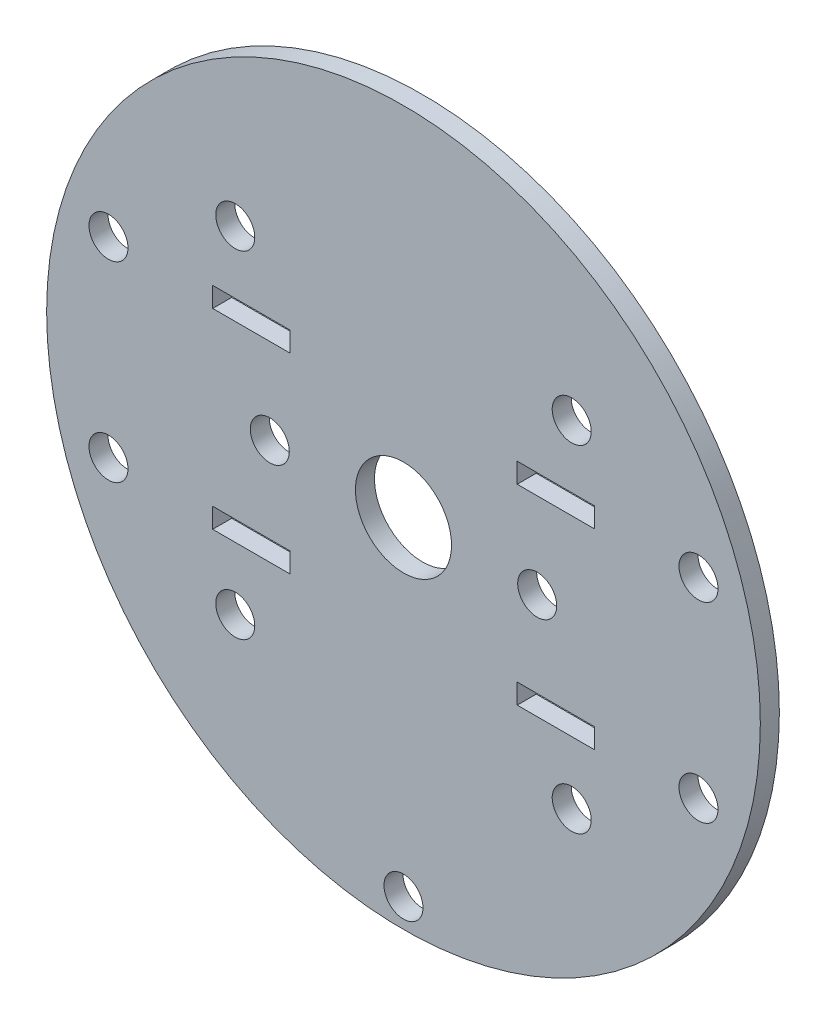
ISO-10303-21;
HEADER;
FILE_DESCRIPTION(('STEP AP214'),'2;1');
FILE_NAME('part.step','',(''),(''),'','','');
FILE_SCHEMA(('AUTOMOTIVE_DESIGN { 1 0 10303 214 1 1 1 1 }'));
ENDSEC;
DATA;
#1=APPLICATION_CONTEXT('core data for automotive mechanical design processes');
#2=APPLICATION_PROTOCOL_DEFINITION('international standard','automotive_design',2000,#1);
#3=PRODUCT_CONTEXT('',#1,'mechanical');
#4=PRODUCT('Part','Part','',(#3));
#5=PRODUCT_RELATED_PRODUCT_CATEGORY('part','',(#4));
#6=PRODUCT_DEFINITION_FORMATION('','',#4);
#7=PRODUCT_DEFINITION_CONTEXT('part definition',#1,'design');
#8=PRODUCT_DEFINITION('design','',#6,#7);
#9=PRODUCT_DEFINITION_SHAPE('','',#8);
#10=(LENGTH_UNIT() NAMED_UNIT(*) SI_UNIT(.MILLI.,.METRE.));
#11=(NAMED_UNIT(*) PLANE_ANGLE_UNIT() SI_UNIT($,.RADIAN.));
#12=(NAMED_UNIT(*) SI_UNIT($,.STERADIAN.) SOLID_ANGLE_UNIT());
#13=UNCERTAINTY_MEASURE_WITH_UNIT(LENGTH_MEASURE(1.E-05),#10,'distance_accuracy_value','');
#14=(GEOMETRIC_REPRESENTATION_CONTEXT(3) GLOBAL_UNCERTAINTY_ASSIGNED_CONTEXT((#13)) GLOBAL_UNIT_ASSIGNED_CONTEXT((#10,
#11,#12)) REPRESENTATION_CONTEXT('',''));
#15=CARTESIAN_POINT('',(0.,0.,0.));
#16=DIRECTION('',(0.,0.,1.));
#17=DIRECTION('',(1.,0.,0.));
#18=AXIS2_PLACEMENT_3D('',#15,#16,#17);
#19=CARTESIAN_POINT('',(0.,0.,2.));
#20=DIRECTION('',(0.,0.,1.));
#21=DIRECTION('',(1.,0.,0.));
#22=AXIS2_PLACEMENT_3D('',#19,#20,#21);
#23=PLANE('',#22);
#24=CARTESIAN_POINT('',(-14.05,0.,2.));
#25=DIRECTION('',(0.,0.,1.));
#26=DIRECTION('',(1.,0.,0.));
#27=AXIS2_PLACEMENT_3D('',#24,#25,#26);
#28=CIRCLE('',#27,2.05);
#29=CARTESIAN_POINT('',(-12.,0.,2.));
#30=VERTEX_POINT('',#29);
#31=EDGE_CURVE('E336',#30,#30,#28,.T.);
#32=ORIENTED_EDGE('',*,*,#31,.F.);
#33=EDGE_LOOP('',(#32));
#34=FACE_BOUND('',#33,.T.);
#35=CARTESIAN_POINT('',(31.,-10.05,2.));
#36=DIRECTION('',(0.,0.,1.));
#37=DIRECTION('',(-1.,0.,0.));
#38=AXIS2_PLACEMENT_3D('',#35,#36,#37);
#39=CIRCLE('',#38,2.05);
#40=CARTESIAN_POINT('',(28.95,-10.05,2.));
#41=VERTEX_POINT('',#40);
#42=EDGE_CURVE('E340',#41,#41,#39,.T.);
#43=ORIENTED_EDGE('',*,*,#42,.F.);
#44=EDGE_LOOP('',(#43));
#45=FACE_BOUND('',#44,.T.);
#46=CARTESIAN_POINT('',(-31.,10.05,2.));
#47=DIRECTION('',(0.,0.,1.));
#48=DIRECTION('',(-1.,0.,0.));
#49=AXIS2_PLACEMENT_3D('',#46,#47,#48);
#50=CIRCLE('',#49,2.05);
#51=CARTESIAN_POINT('',(-33.05,10.05,2.));
#52=VERTEX_POINT('',#51);
#53=EDGE_CURVE('E343',#52,#52,#50,.T.);
#54=ORIENTED_EDGE('',*,*,#53,.F.);
#55=EDGE_LOOP('',(#54));
#56=FACE_BOUND('',#55,.T.);
#57=DIRECTION('',(0.,1.,0.));
#58=VECTOR('',#57,1.);
#59=CARTESIAN_POINT('',(-11.95,-11.1,2.));
#60=LINE('',#59,#58);
#61=CARTESIAN_POINT('',(-11.95,-11.1,2.));
#62=VERTEX_POINT('',#61);
#63=CARTESIAN_POINT('',(-11.95,-8.99999999999999,2.));
#64=VERTEX_POINT('',#63);
#65=EDGE_CURVE('E156',#62,#64,#60,.T.);
#66=ORIENTED_EDGE('',*,*,#65,.F.);
#67=DIRECTION('',(1.,0.,0.));
#68=VECTOR('',#67,1.);
#69=CARTESIAN_POINT('',(-11.95,-11.1,2.));
#70=LINE('',#69,#68);
#71=CARTESIAN_POINT('',(-20.05,-11.1,2.));
#72=VERTEX_POINT('',#71);
#73=EDGE_CURVE('E148',#72,#62,#70,.T.);
#74=ORIENTED_EDGE('',*,*,#73,.F.);
#75=DIRECTION('',(0.,-1.,0.));
#76=VECTOR('',#75,1.);
#77=CARTESIAN_POINT('',(-20.05,-11.1,2.));
#78=LINE('',#77,#76);
#79=CARTESIAN_POINT('',(-20.05,-8.99999999999999,2.));
#80=VERTEX_POINT('',#79);
#81=EDGE_CURVE('E171',#80,#72,#78,.T.);
#82=ORIENTED_EDGE('',*,*,#81,.F.);
#83=DIRECTION('',(-1.,0.,0.));
#84=VECTOR('',#83,1.);
#85=CARTESIAN_POINT('',(-11.95,-8.99999999999999,2.));
#86=LINE('',#85,#84);
#87=EDGE_CURVE('E169',#64,#80,#86,.T.);
#88=ORIENTED_EDGE('',*,*,#87,.F.);
#89=EDGE_LOOP('',(#66,#74,#82,#88));
#90=FACE_BOUND('',#89,.T.);
#91=DIRECTION('',(0.,-1.,0.));
#92=VECTOR('',#91,1.);
#93=CARTESIAN_POINT('',(-20.05,11.1,2.));
#94=LINE('',#93,#92);
#95=CARTESIAN_POINT('',(-20.05,11.1,2.));
#96=VERTEX_POINT('',#95);
#97=CARTESIAN_POINT('',(-20.05,8.99999999999999,2.));
#98=VERTEX_POINT('',#97);
#99=EDGE_CURVE('E189',#96,#98,#94,.T.);
#100=ORIENTED_EDGE('',*,*,#99,.F.);
#101=DIRECTION('',(-1.,0.,0.));
#102=VECTOR('',#101,1.);
#103=CARTESIAN_POINT('',(-11.95,11.1,2.));
#104=LINE('',#103,#102);
#105=CARTESIAN_POINT('',(-11.95,11.1,2.));
#106=VERTEX_POINT('',#105);
#107=EDGE_CURVE('E187',#106,#96,#104,.T.);
#108=ORIENTED_EDGE('',*,*,#107,.F.);
#109=DIRECTION('',(0.,1.,0.));
#110=VECTOR('',#109,1.);
#111=CARTESIAN_POINT('',(-11.95,11.1,2.));
#112=LINE('',#111,#110);
#113=CARTESIAN_POINT('',(-11.95,8.99999999999999,2.));
#114=VERTEX_POINT('',#113);
#115=EDGE_CURVE('E195',#114,#106,#112,.T.);
#116=ORIENTED_EDGE('',*,*,#115,.F.);
#117=DIRECTION('',(1.,0.,0.));
#118=VECTOR('',#117,1.);
#119=CARTESIAN_POINT('',(-11.95,8.99999999999999,2.));
#120=LINE('',#119,#118);
#121=EDGE_CURVE('E192',#98,#114,#120,.T.);
#122=ORIENTED_EDGE('',*,*,#121,.F.);
#123=EDGE_LOOP('',(#100,#108,#116,#122));
#124=FACE_BOUND('',#123,.T.);
#125=CARTESIAN_POINT('',(17.6776695296637,-17.6776695296637,2.));
#126=DIRECTION('',(0.,0.,1.));
#127=DIRECTION('',(1.,0.,0.));
#128=AXIS2_PLACEMENT_3D('',#125,#126,#127);
#129=CIRCLE('',#128,2.05);
#130=CARTESIAN_POINT('',(19.7276695296637,-17.6776695296637,2.));
#131=VERTEX_POINT('',#130);
#132=EDGE_CURVE('E218',#131,#131,#129,.T.);
#133=ORIENTED_EDGE('',*,*,#132,.F.);
#134=EDGE_LOOP('',(#133));
#135=FACE_BOUND('',#134,.T.);
#136=CARTESIAN_POINT('',(-17.6776695296637,17.6776695296637,2.));
#137=DIRECTION('',(0.,0.,1.));
#138=DIRECTION('',(1.,0.,0.));
#139=AXIS2_PLACEMENT_3D('',#136,#137,#138);
#140=CIRCLE('',#139,2.05);
#141=CARTESIAN_POINT('',(-15.6276695296637,17.6776695296637,2.));
#142=VERTEX_POINT('',#141);
#143=EDGE_CURVE('E230',#142,#142,#140,.T.);
#144=ORIENTED_EDGE('',*,*,#143,.F.);
#145=EDGE_LOOP('',(#144));
#146=FACE_BOUND('',#145,.T.);
#147=CARTESIAN_POINT('',(0.,0.,2.));
#148=DIRECTION('',(0.,0.,1.));
#149=DIRECTION('',(1.,0.,0.));
#150=AXIS2_PLACEMENT_3D('',#147,#148,#149);
#151=CIRCLE('',#150,5.05);
#152=CARTESIAN_POINT('',(5.05,0.,2.));
#153=VERTEX_POINT('',#152);
#154=EDGE_CURVE('E304',#153,#153,#151,.T.);
#155=ORIENTED_EDGE('',*,*,#154,.F.);
#156=EDGE_LOOP('',(#155));
#157=FACE_BOUND('',#156,.T.);
#158=CARTESIAN_POINT('',(0.,0.,2.));
#159=DIRECTION('',(0.,0.,1.));
#160=DIRECTION('',(1.,0.,0.));
#161=AXIS2_PLACEMENT_3D('',#158,#159,#160);
#162=CIRCLE('',#161,37.5);
#163=CARTESIAN_POINT('',(37.5,0.,2.));
#164=VERTEX_POINT('',#163);
#165=EDGE_CURVE('E11',#164,#164,#162,.T.);
#166=ORIENTED_EDGE('',*,*,#165,.T.);
#167=EDGE_LOOP('',(#166));
#168=FACE_BOUND('',#167,.T.);
#169=CARTESIAN_POINT('',(-17.6776695296637,-17.6776695296637,2.));
#170=DIRECTION('',(0.,0.,1.));
#171=DIRECTION('',(1.,0.,0.));
#172=AXIS2_PLACEMENT_3D('',#169,#170,#171);
#173=CIRCLE('',#172,2.05);
#174=CARTESIAN_POINT('',(-15.6276695296637,-17.6776695296637,2.));
#175=VERTEX_POINT('',#174);
#176=EDGE_CURVE('E298',#175,#175,#173,.T.);
#177=ORIENTED_EDGE('',*,*,#176,.F.);
#178=EDGE_LOOP('',(#177));
#179=FACE_BOUND('',#178,.T.);
#180=DIRECTION('',(0.,1.,0.));
#181=VECTOR('',#180,1.);
#182=CARTESIAN_POINT('',(20.05,-11.1,2.));
#183=LINE('',#182,#181);
#184=CARTESIAN_POINT('',(20.05,-11.1,2.));
#185=VERTEX_POINT('',#184);
#186=CARTESIAN_POINT('',(20.05,-9.,2.));
#187=VERTEX_POINT('',#186);
#188=EDGE_CURVE('E269',#185,#187,#183,.T.);
#189=ORIENTED_EDGE('',*,*,#188,.F.);
#190=DIRECTION('',(1.,0.,0.));
#191=VECTOR('',#190,1.);
#192=CARTESIAN_POINT('',(11.95,-11.1,2.));
#193=LINE('',#192,#191);
#194=CARTESIAN_POINT('',(11.95,-11.1,2.));
#195=VERTEX_POINT('',#194);
#196=EDGE_CURVE('E267',#195,#185,#193,.T.);
#197=ORIENTED_EDGE('',*,*,#196,.F.);
#198=DIRECTION('',(0.,-1.,0.));
#199=VECTOR('',#198,1.);
#200=CARTESIAN_POINT('',(11.95,-11.1,2.));
#201=LINE('',#200,#199);
#202=CARTESIAN_POINT('',(11.95,-9.,2.));
#203=VERTEX_POINT('',#202);
#204=EDGE_CURVE('E275',#203,#195,#201,.T.);
#205=ORIENTED_EDGE('',*,*,#204,.F.);
#206=DIRECTION('',(-1.,0.,0.));
#207=VECTOR('',#206,1.);
#208=CARTESIAN_POINT('',(11.95,-9.,2.));
#209=LINE('',#208,#207);
#210=EDGE_CURVE('E272',#187,#203,#209,.T.);
#211=ORIENTED_EDGE('',*,*,#210,.F.);
#212=EDGE_LOOP('',(#189,#197,#205,#211));
#213=FACE_BOUND('',#212,.T.);
#214=DIRECTION('',(0.,-1.,0.));
#215=VECTOR('',#214,1.);
#216=CARTESIAN_POINT('',(11.95,11.1,2.));
#217=LINE('',#216,#215);
#218=CARTESIAN_POINT('',(11.95,11.1,2.));
#219=VERTEX_POINT('',#218);
#220=CARTESIAN_POINT('',(11.95,9.,2.));
#221=VERTEX_POINT('',#220);
#222=EDGE_CURVE('E238',#219,#221,#217,.T.);
#223=ORIENTED_EDGE('',*,*,#222,.F.);
#224=DIRECTION('',(-1.,0.,0.));
#225=VECTOR('',#224,1.);
#226=CARTESIAN_POINT('',(11.95,11.1,2.));
#227=LINE('',#226,#225);
#228=CARTESIAN_POINT('',(20.05,11.1,2.));
#229=VERTEX_POINT('',#228);
#230=EDGE_CURVE('E236',#229,#219,#227,.T.);
#231=ORIENTED_EDGE('',*,*,#230,.F.);
#232=DIRECTION('',(0.,1.,0.));
#233=VECTOR('',#232,1.);
#234=CARTESIAN_POINT('',(20.05,11.1,2.));
#235=LINE('',#234,#233);
#236=CARTESIAN_POINT('',(20.05,9.,2.));
#237=VERTEX_POINT('',#236);
#238=EDGE_CURVE('E244',#237,#229,#235,.T.);
#239=ORIENTED_EDGE('',*,*,#238,.F.);
#240=DIRECTION('',(1.,0.,0.));
#241=VECTOR('',#240,1.);
#242=CARTESIAN_POINT('',(11.95,9.,2.));
#243=LINE('',#242,#241);
#244=EDGE_CURVE('E241',#221,#237,#243,.T.);
#245=ORIENTED_EDGE('',*,*,#244,.F.);
#246=EDGE_LOOP('',(#223,#231,#239,#245));
#247=FACE_BOUND('',#246,.T.);
#248=CARTESIAN_POINT('',(17.6776695296637,17.6776695296637,2.));
#249=DIRECTION('',(0.,0.,1.));
#250=DIRECTION('',(1.,0.,0.));
#251=AXIS2_PLACEMENT_3D('',#248,#249,#250);
#252=CIRCLE('',#251,2.05);
#253=CARTESIAN_POINT('',(19.7276695296637,17.6776695296637,2.));
#254=VERTEX_POINT('',#253);
#255=EDGE_CURVE('E224',#254,#254,#252,.T.);
#256=ORIENTED_EDGE('',*,*,#255,.F.);
#257=EDGE_LOOP('',(#256));
#258=FACE_BOUND('',#257,.T.);
#259=CARTESIAN_POINT('',(-31.,-10.05,2.));
#260=DIRECTION('',(0.,0.,1.));
#261=DIRECTION('',(1.,0.,0.));
#262=AXIS2_PLACEMENT_3D('',#259,#260,#261);
#263=CIRCLE('',#262,2.05);
#264=CARTESIAN_POINT('',(-28.95,-10.05,2.));
#265=VERTEX_POINT('',#264);
#266=EDGE_CURVE('E177',#265,#265,#263,.T.);
#267=ORIENTED_EDGE('',*,*,#266,.F.);
#268=EDGE_LOOP('',(#267));
#269=FACE_BOUND('',#268,.T.);
#270=CARTESIAN_POINT('',(31.,10.05,2.));
#271=DIRECTION('',(0.,0.,1.));
#272=DIRECTION('',(1.,0.,0.));
#273=AXIS2_PLACEMENT_3D('',#270,#271,#272);
#274=CIRCLE('',#273,2.05);
#275=CARTESIAN_POINT('',(33.05,10.05,2.));
#276=VERTEX_POINT('',#275);
#277=EDGE_CURVE('E350',#276,#276,#274,.T.);
#278=ORIENTED_EDGE('',*,*,#277,.F.);
#279=EDGE_LOOP('',(#278));
#280=FACE_BOUND('',#279,.T.);
#281=CARTESIAN_POINT('',(14.05,0.,2.));
#282=DIRECTION('',(0.,0.,1.));
#283=DIRECTION('',(1.,0.,0.));
#284=AXIS2_PLACEMENT_3D('',#281,#282,#283);
#285=CIRCLE('',#284,2.05);
#286=CARTESIAN_POINT('',(16.1,0.,2.));
#287=VERTEX_POINT('',#286);
#288=EDGE_CURVE('E369',#287,#287,#285,.T.);
#289=ORIENTED_EDGE('',*,*,#288,.F.);
#290=EDGE_LOOP('',(#289));
#291=FACE_BOUND('',#290,.T.);
#292=CARTESIAN_POINT('',(0.,-34.5,2.));
#293=DIRECTION('',(0.,0.,1.));
#294=DIRECTION('',(1.,0.,0.));
#295=AXIS2_PLACEMENT_3D('',#292,#293,#294);
#296=CIRCLE('',#295,2.05);
#297=CARTESIAN_POINT('',(2.05000000000001,-34.5,2.));
#298=VERTEX_POINT('',#297);
#299=EDGE_CURVE('E372',#298,#298,#296,.T.);
#300=ORIENTED_EDGE('',*,*,#299,.F.);
#301=EDGE_LOOP('',(#300));
#302=FACE_BOUND('',#301,.T.);
#303=ADVANCED_FACE('F35',(#34,#45,#56,#90,#124,#135,#146,#157,#168,#179,#213,#247,#258,#269,
#280,#291,#302),#23,.T.);
#304=CARTESIAN_POINT('',(0.,0.,0.));
#305=DIRECTION('',(0.,0.,1.));
#306=DIRECTION('',(1.,0.,0.));
#307=AXIS2_PLACEMENT_3D('',#304,#305,#306);
#308=PLANE('',#307);
#309=DIRECTION('',(-1.,0.,0.));
#310=VECTOR('',#309,1.);
#311=CARTESIAN_POINT('',(-11.95,11.1,0.));
#312=LINE('',#311,#310);
#313=CARTESIAN_POINT('',(-11.95,11.1,0.));
#314=VERTEX_POINT('',#313);
#315=CARTESIAN_POINT('',(-20.05,11.1,0.));
#316=VERTEX_POINT('',#315);
#317=EDGE_CURVE('E164',#314,#316,#312,.T.);
#318=ORIENTED_EDGE('',*,*,#317,.T.);
#319=DIRECTION('',(0.,-1.,0.));
#320=VECTOR('',#319,1.);
#321=CARTESIAN_POINT('',(-20.05,11.1,0.));
#322=LINE('',#321,#320);
#323=CARTESIAN_POINT('',(-20.05,8.99999999999999,0.));
#324=VERTEX_POINT('',#323);
#325=EDGE_CURVE('E200',#316,#324,#322,.T.);
#326=ORIENTED_EDGE('',*,*,#325,.T.);
#327=DIRECTION('',(1.,0.,0.));
#328=VECTOR('',#327,1.);
#329=CARTESIAN_POINT('',(-11.95,8.99999999999999,0.));
#330=LINE('',#329,#328);
#331=CARTESIAN_POINT('',(-11.95,8.99999999999999,0.));
#332=VERTEX_POINT('',#331);
#333=EDGE_CURVE('E203',#324,#332,#330,.T.);
#334=ORIENTED_EDGE('',*,*,#333,.T.);
#335=DIRECTION('',(0.,1.,0.));
#336=VECTOR('',#335,1.);
#337=CARTESIAN_POINT('',(-11.95,11.1,0.));
#338=LINE('',#337,#336);
#339=EDGE_CURVE('E190',#332,#314,#338,.T.);
#340=ORIENTED_EDGE('',*,*,#339,.T.);
#341=EDGE_LOOP('',(#318,#326,#334,#340));
#342=FACE_BOUND('',#341,.T.);
#343=DIRECTION('',(1.,0.,0.));
#344=VECTOR('',#343,1.);
#345=CARTESIAN_POINT('',(11.95,-11.1,0.));
#346=LINE('',#345,#344);
#347=CARTESIAN_POINT('',(11.95,-11.1,0.));
#348=VERTEX_POINT('',#347);
#349=CARTESIAN_POINT('',(20.05,-11.1,0.));
#350=VERTEX_POINT('',#349);
#351=EDGE_CURVE('E266',#348,#350,#346,.T.);
#352=ORIENTED_EDGE('',*,*,#351,.T.);
#353=DIRECTION('',(0.,1.,0.));
#354=VECTOR('',#353,1.);
#355=CARTESIAN_POINT('',(20.05,-11.1,0.));
#356=LINE('',#355,#354);
#357=CARTESIAN_POINT('',(20.05,-9.,0.));
#358=VERTEX_POINT('',#357);
#359=EDGE_CURVE('E280',#350,#358,#356,.T.);
#360=ORIENTED_EDGE('',*,*,#359,.T.);
#361=DIRECTION('',(-1.,0.,0.));
#362=VECTOR('',#361,1.);
#363=CARTESIAN_POINT('',(11.95,-9.,0.));
#364=LINE('',#363,#362);
#365=CARTESIAN_POINT('',(11.95,-9.,0.));
#366=VERTEX_POINT('',#365);
#367=EDGE_CURVE('E283',#358,#366,#364,.T.);
#368=ORIENTED_EDGE('',*,*,#367,.T.);
#369=DIRECTION('',(0.,-1.,0.));
#370=VECTOR('',#369,1.);
#371=CARTESIAN_POINT('',(11.95,-11.1,0.));
#372=LINE('',#371,#370);
#373=EDGE_CURVE('E270',#366,#348,#372,.T.);
#374=ORIENTED_EDGE('',*,*,#373,.T.);
#375=EDGE_LOOP('',(#352,#360,#368,#374));
#376=FACE_BOUND('',#375,.T.);
#377=CARTESIAN_POINT('',(0.,0.,0.));
#378=DIRECTION('',(0.,0.,1.));
#379=DIRECTION('',(1.,0.,0.));
#380=AXIS2_PLACEMENT_3D('',#377,#378,#379);
#381=CIRCLE('',#380,37.5);
#382=CARTESIAN_POINT('',(37.5,0.,0.));
#383=VERTEX_POINT('',#382);
#384=EDGE_CURVE('E39',#383,#383,#381,.T.);
#385=ORIENTED_EDGE('',*,*,#384,.F.);
#386=EDGE_LOOP('',(#385));
#387=FACE_BOUND('',#386,.T.);
#388=CARTESIAN_POINT('',(0.,0.,0.));
#389=DIRECTION('',(0.,0.,1.));
#390=DIRECTION('',(1.,0.,0.));
#391=AXIS2_PLACEMENT_3D('',#388,#389,#390);
#392=CIRCLE('',#391,5.05);
#393=CARTESIAN_POINT('',(5.05,0.,0.));
#394=VERTEX_POINT('',#393);
#395=EDGE_CURVE('E301',#394,#394,#392,.T.);
#396=ORIENTED_EDGE('',*,*,#395,.T.);
#397=EDGE_LOOP('',(#396));
#398=FACE_BOUND('',#397,.T.);
#399=CARTESIAN_POINT('',(-17.6776695296637,-17.6776695296637,0.));
#400=DIRECTION('',(0.,0.,1.));
#401=DIRECTION('',(1.,0.,0.));
#402=AXIS2_PLACEMENT_3D('',#399,#400,#401);
#403=CIRCLE('',#402,2.05);
#404=CARTESIAN_POINT('',(-15.6276695296637,-17.6776695296637,0.));
#405=VERTEX_POINT('',#404);
#406=EDGE_CURVE('E297',#405,#405,#403,.T.);
#407=ORIENTED_EDGE('',*,*,#406,.T.);
#408=EDGE_LOOP('',(#407));
#409=FACE_BOUND('',#408,.T.);
#410=DIRECTION('',(-1.,0.,0.));
#411=VECTOR('',#410,1.);
#412=CARTESIAN_POINT('',(11.95,11.1,0.));
#413=LINE('',#412,#411);
#414=CARTESIAN_POINT('',(20.05,11.1,0.));
#415=VERTEX_POINT('',#414);
#416=CARTESIAN_POINT('',(11.95,11.1,0.));
#417=VERTEX_POINT('',#416);
#418=EDGE_CURVE('E233',#415,#417,#413,.T.);
#419=ORIENTED_EDGE('',*,*,#418,.T.);
#420=DIRECTION('',(0.,-1.,0.));
#421=VECTOR('',#420,1.);
#422=CARTESIAN_POINT('',(11.95,11.1,0.));
#423=LINE('',#422,#421);
#424=CARTESIAN_POINT('',(11.95,9.,0.));
#425=VERTEX_POINT('',#424);
#426=EDGE_CURVE('E249',#417,#425,#423,.T.);
#427=ORIENTED_EDGE('',*,*,#426,.T.);
#428=DIRECTION('',(1.,0.,0.));
#429=VECTOR('',#428,1.);
#430=CARTESIAN_POINT('',(11.95,9.,0.));
#431=LINE('',#430,#429);
#432=CARTESIAN_POINT('',(20.05,9.,0.));
#433=VERTEX_POINT('',#432);
#434=EDGE_CURVE('E252',#425,#433,#431,.T.);
#435=ORIENTED_EDGE('',*,*,#434,.T.);
#436=DIRECTION('',(0.,1.,0.));
#437=VECTOR('',#436,1.);
#438=CARTESIAN_POINT('',(20.05,11.1,0.));
#439=LINE('',#438,#437);
#440=EDGE_CURVE('E239',#433,#415,#439,.T.);
#441=ORIENTED_EDGE('',*,*,#440,.T.);
#442=EDGE_LOOP('',(#419,#427,#435,#441));
#443=FACE_BOUND('',#442,.T.);
#444=CARTESIAN_POINT('',(-17.6776695296637,17.6776695296637,0.));
#445=DIRECTION('',(0.,0.,1.));
#446=DIRECTION('',(1.,0.,0.));
#447=AXIS2_PLACEMENT_3D('',#444,#445,#446);
#448=CIRCLE('',#447,2.05);
#449=CARTESIAN_POINT('',(-15.6276695296637,17.6776695296637,0.));
#450=VERTEX_POINT('',#449);
#451=EDGE_CURVE('E227',#450,#450,#448,.T.);
#452=ORIENTED_EDGE('',*,*,#451,.T.);
#453=EDGE_LOOP('',(#452));
#454=FACE_BOUND('',#453,.T.);
#455=CARTESIAN_POINT('',(17.6776695296637,17.6776695296637,0.));
#456=DIRECTION('',(0.,0.,1.));
#457=DIRECTION('',(1.,0.,0.));
#458=AXIS2_PLACEMENT_3D('',#455,#456,#457);
#459=CIRCLE('',#458,2.05);
#460=CARTESIAN_POINT('',(19.7276695296637,17.6776695296637,0.));
#461=VERTEX_POINT('',#460);
#462=EDGE_CURVE('E221',#461,#461,#459,.T.);
#463=ORIENTED_EDGE('',*,*,#462,.T.);
#464=EDGE_LOOP('',(#463));
#465=FACE_BOUND('',#464,.T.);
#466=CARTESIAN_POINT('',(17.6776695296637,-17.6776695296637,0.));
#467=DIRECTION('',(0.,0.,1.));
#468=DIRECTION('',(1.,0.,0.));
#469=AXIS2_PLACEMENT_3D('',#466,#467,#468);
#470=CIRCLE('',#469,2.05);
#471=CARTESIAN_POINT('',(19.7276695296637,-17.6776695296637,0.));
#472=VERTEX_POINT('',#471);
#473=EDGE_CURVE('E217',#472,#472,#470,.T.);
#474=ORIENTED_EDGE('',*,*,#473,.T.);
#475=EDGE_LOOP('',(#474));
#476=FACE_BOUND('',#475,.T.);
#477=DIRECTION('',(1.,0.,0.));
#478=VECTOR('',#477,1.);
#479=CARTESIAN_POINT('',(-11.95,-11.1,0.));
#480=LINE('',#479,#478);
#481=CARTESIAN_POINT('',(-20.05,-11.1,0.));
#482=VERTEX_POINT('',#481);
#483=CARTESIAN_POINT('',(-11.95,-11.1,0.));
#484=VERTEX_POINT('',#483);
#485=EDGE_CURVE('E58',#482,#484,#480,.T.);
#486=ORIENTED_EDGE('',*,*,#485,.T.);
#487=DIRECTION('',(0.,1.,0.));
#488=VECTOR('',#487,1.);
#489=CARTESIAN_POINT('',(-11.95,-11.1,0.));
#490=LINE('',#489,#488);
#491=CARTESIAN_POINT('',(-11.95,-8.99999999999999,0.));
#492=VERTEX_POINT('',#491);
#493=EDGE_CURVE('E163',#484,#492,#490,.T.);
#494=ORIENTED_EDGE('',*,*,#493,.T.);
#495=DIRECTION('',(-1.,0.,0.));
#496=VECTOR('',#495,1.);
#497=CARTESIAN_POINT('',(-11.95,-8.99999999999999,0.));
#498=LINE('',#497,#496);
#499=CARTESIAN_POINT('',(-20.05,-8.99999999999999,0.));
#500=VERTEX_POINT('',#499);
#501=EDGE_CURVE('E179',#492,#500,#498,.T.);
#502=ORIENTED_EDGE('',*,*,#501,.T.);
#503=DIRECTION('',(0.,-1.,0.));
#504=VECTOR('',#503,1.);
#505=CARTESIAN_POINT('',(-20.05,-11.1,0.));
#506=LINE('',#505,#504);
#507=EDGE_CURVE('E157',#500,#482,#506,.T.);
#508=ORIENTED_EDGE('',*,*,#507,.T.);
#509=EDGE_LOOP('',(#486,#494,#502,#508));
#510=FACE_BOUND('',#509,.T.);
#511=CARTESIAN_POINT('',(-31.,-10.05,0.));
#512=DIRECTION('',(0.,0.,1.));
#513=DIRECTION('',(1.,0.,0.));
#514=AXIS2_PLACEMENT_3D('',#511,#512,#513);
#515=CIRCLE('',#514,2.05);
#516=CARTESIAN_POINT('',(-28.95,-10.05,0.));
#517=VERTEX_POINT('',#516);
#518=EDGE_CURVE('E345',#517,#517,#515,.T.);
#519=ORIENTED_EDGE('',*,*,#518,.T.);
#520=EDGE_LOOP('',(#519));
#521=FACE_BOUND('',#520,.T.);
#522=CARTESIAN_POINT('',(-31.,10.05,0.));
#523=DIRECTION('',(0.,0.,1.));
#524=DIRECTION('',(-1.,0.,0.));
#525=AXIS2_PLACEMENT_3D('',#522,#523,#524);
#526=CIRCLE('',#525,2.05);
#527=CARTESIAN_POINT('',(-33.05,10.05,0.));
#528=VERTEX_POINT('',#527);
#529=EDGE_CURVE('E346',#528,#528,#526,.T.);
#530=ORIENTED_EDGE('',*,*,#529,.T.);
#531=EDGE_LOOP('',(#530));
#532=FACE_BOUND('',#531,.T.);
#533=CARTESIAN_POINT('',(31.,10.05,0.));
#534=DIRECTION('',(0.,0.,1.));
#535=DIRECTION('',(1.,0.,0.));
#536=AXIS2_PLACEMENT_3D('',#533,#534,#535);
#537=CIRCLE('',#536,2.05);
#538=CARTESIAN_POINT('',(33.05,10.05,0.));
#539=VERTEX_POINT('',#538);
#540=EDGE_CURVE('E353',#539,#539,#537,.T.);
#541=ORIENTED_EDGE('',*,*,#540,.T.);
#542=EDGE_LOOP('',(#541));
#543=FACE_BOUND('',#542,.T.);
#544=CARTESIAN_POINT('',(31.,-10.05,0.));
#545=DIRECTION('',(0.,0.,1.));
#546=DIRECTION('',(-1.,0.,0.));
#547=AXIS2_PLACEMENT_3D('',#544,#545,#546);
#548=CIRCLE('',#547,2.05);
#549=CARTESIAN_POINT('',(28.95,-10.05,0.));
#550=VERTEX_POINT('',#549);
#551=EDGE_CURVE('E385',#550,#550,#548,.T.);
#552=ORIENTED_EDGE('',*,*,#551,.T.);
#553=EDGE_LOOP('',(#552));
#554=FACE_BOUND('',#553,.T.);
#555=CARTESIAN_POINT('',(14.05,0.,0.));
#556=DIRECTION('',(0.,0.,1.));
#557=DIRECTION('',(1.,0.,0.));
#558=AXIS2_PLACEMENT_3D('',#555,#556,#557);
#559=CIRCLE('',#558,2.05);
#560=CARTESIAN_POINT('',(16.1,0.,0.));
#561=VERTEX_POINT('',#560);
#562=EDGE_CURVE('E382',#561,#561,#559,.T.);
#563=ORIENTED_EDGE('',*,*,#562,.T.);
#564=EDGE_LOOP('',(#563));
#565=FACE_BOUND('',#564,.T.);
#566=CARTESIAN_POINT('',(-14.05,0.,0.));
#567=DIRECTION('',(0.,0.,1.));
#568=DIRECTION('',(1.,0.,0.));
#569=AXIS2_PLACEMENT_3D('',#566,#567,#568);
#570=CIRCLE('',#569,2.05);
#571=CARTESIAN_POINT('',(-12.,0.,0.));
#572=VERTEX_POINT('',#571);
#573=EDGE_CURVE('E374',#572,#572,#570,.T.);
#574=ORIENTED_EDGE('',*,*,#573,.T.);
#575=EDGE_LOOP('',(#574));
#576=FACE_BOUND('',#575,.T.);
#577=CARTESIAN_POINT('',(0.,-34.5,0.));
#578=DIRECTION('',(0.,0.,1.));
#579=DIRECTION('',(1.,0.,0.));
#580=AXIS2_PLACEMENT_3D('',#577,#578,#579);
#581=CIRCLE('',#580,2.05);
#582=CARTESIAN_POINT('',(2.05000000000001,-34.5,0.));
#583=VERTEX_POINT('',#582);
#584=EDGE_CURVE('E375',#583,#583,#581,.T.);
#585=ORIENTED_EDGE('',*,*,#584,.T.);
#586=EDGE_LOOP('',(#585));
#587=FACE_BOUND('',#586,.T.);
#588=ADVANCED_FACE('F310',(#342,#376,#387,#398,#409,#443,#454,#465,#476,#510,#521,#532,#543,
#554,#565,#576,#587),#308,.F.);
#589=CARTESIAN_POINT('',(0.,0.,2.));
#590=DIRECTION('',(0.,0.,-1.));
#591=DIRECTION('',(-1.,0.,0.));
#592=AXIS2_PLACEMENT_3D('',#589,#590,#591);
#593=CYLINDRICAL_SURFACE('',#592,37.5);
#594=ORIENTED_EDGE('',*,*,#165,.F.);
#595=EDGE_LOOP('',(#594));
#596=FACE_BOUND('',#595,.T.);
#597=ORIENTED_EDGE('',*,*,#384,.T.);
#598=EDGE_LOOP('',(#597));
#599=FACE_BOUND('',#598,.T.);
#600=ADVANCED_FACE('F37',(#596,#599),#593,.T.);
#601=CARTESIAN_POINT('',(0.,0.,2.));
#602=DIRECTION('',(0.,0.,-1.));
#603=DIRECTION('',(-1.,0.,0.));
#604=AXIS2_PLACEMENT_3D('',#601,#602,#603);
#605=CYLINDRICAL_SURFACE('',#604,5.05);
#606=ORIENTED_EDGE('',*,*,#154,.T.);
#607=EDGE_LOOP('',(#606));
#608=FACE_BOUND('',#607,.T.);
#609=ORIENTED_EDGE('',*,*,#395,.F.);
#610=EDGE_LOOP('',(#609));
#611=FACE_BOUND('',#610,.T.);
#612=ADVANCED_FACE('F313',(#608,#611),#605,.F.);
#613=CARTESIAN_POINT('',(-17.6776695296637,-17.6776695296637,2.));
#614=DIRECTION('',(0.,0.,-1.));
#615=DIRECTION('',(-1.,0.,0.));
#616=AXIS2_PLACEMENT_3D('',#613,#614,#615);
#617=CYLINDRICAL_SURFACE('',#616,2.05);
#618=ORIENTED_EDGE('',*,*,#176,.T.);
#619=EDGE_LOOP('',(#618));
#620=FACE_BOUND('',#619,.T.);
#621=ORIENTED_EDGE('',*,*,#406,.F.);
#622=EDGE_LOOP('',(#621));
#623=FACE_BOUND('',#622,.T.);
#624=ADVANCED_FACE('F315',(#620,#623),#617,.F.);
#625=CARTESIAN_POINT('',(11.95,-11.1,2.));
#626=DIRECTION('',(0.,1.,0.));
#627=DIRECTION('',(-1.,0.,0.));
#628=AXIS2_PLACEMENT_3D('',#625,#626,#627);
#629=PLANE('',#628);
#630=ORIENTED_EDGE('',*,*,#351,.F.);
#631=DIRECTION('',(0.,0.,-1.));
#632=VECTOR('',#631,1.);
#633=CARTESIAN_POINT('',(11.95,-11.1,2.));
#634=LINE('',#633,#632);
#635=EDGE_CURVE('E277',#195,#348,#634,.T.);
#636=ORIENTED_EDGE('',*,*,#635,.F.);
#637=ORIENTED_EDGE('',*,*,#196,.T.);
#638=DIRECTION('',(0.,0.,-1.));
#639=VECTOR('',#638,1.);
#640=CARTESIAN_POINT('',(20.05,-11.1,2.));
#641=LINE('',#640,#639);
#642=EDGE_CURVE('E294',#185,#350,#641,.T.);
#643=ORIENTED_EDGE('',*,*,#642,.T.);
#644=EDGE_LOOP('',(#630,#636,#637,#643));
#645=FACE_BOUND('',#644,.T.);
#646=ADVANCED_FACE('F322',(#645),#629,.T.);
#647=CARTESIAN_POINT('',(20.05,-11.1,2.));
#648=DIRECTION('',(-1.,0.,0.));
#649=DIRECTION('',(0.,0.,1.));
#650=AXIS2_PLACEMENT_3D('',#647,#648,#649);
#651=PLANE('',#650);
#652=ORIENTED_EDGE('',*,*,#359,.F.);
#653=ORIENTED_EDGE('',*,*,#642,.F.);
#654=ORIENTED_EDGE('',*,*,#188,.T.);
#655=DIRECTION('',(0.,0.,-1.));
#656=VECTOR('',#655,1.);
#657=CARTESIAN_POINT('',(20.05,-9.,2.));
#658=LINE('',#657,#656);
#659=EDGE_CURVE('E292',#187,#358,#658,.T.);
#660=ORIENTED_EDGE('',*,*,#659,.T.);
#661=EDGE_LOOP('',(#652,#653,#654,#660));
#662=FACE_BOUND('',#661,.T.);
#663=ADVANCED_FACE('F475',(#662),#651,.T.);
#664=CARTESIAN_POINT('',(11.95,-9.,2.));
#665=DIRECTION('',(0.,-1.,0.));
#666=DIRECTION('',(1.,0.,0.));
#667=AXIS2_PLACEMENT_3D('',#664,#665,#666);
#668=PLANE('',#667);
#669=ORIENTED_EDGE('',*,*,#367,.F.);
#670=ORIENTED_EDGE('',*,*,#659,.F.);
#671=ORIENTED_EDGE('',*,*,#210,.T.);
#672=DIRECTION('',(0.,0.,-1.));
#673=VECTOR('',#672,1.);
#674=CARTESIAN_POINT('',(11.95,-9.,2.));
#675=LINE('',#674,#673);
#676=EDGE_CURVE('E290',#203,#366,#675,.T.);
#677=ORIENTED_EDGE('',*,*,#676,.T.);
#678=EDGE_LOOP('',(#669,#670,#671,#677));
#679=FACE_BOUND('',#678,.T.);
#680=ADVANCED_FACE('F471',(#679),#668,.T.);
#681=CARTESIAN_POINT('',(11.95,-11.1,2.));
#682=DIRECTION('',(1.,0.,0.));
#683=DIRECTION('',(0.,0.,-1.));
#684=AXIS2_PLACEMENT_3D('',#681,#682,#683);
#685=PLANE('',#684);
#686=ORIENTED_EDGE('',*,*,#373,.F.);
#687=ORIENTED_EDGE('',*,*,#676,.F.);
#688=ORIENTED_EDGE('',*,*,#204,.T.);
#689=ORIENTED_EDGE('',*,*,#635,.T.);
#690=EDGE_LOOP('',(#686,#687,#688,#689));
#691=FACE_BOUND('',#690,.T.);
#692=ADVANCED_FACE('F467',(#691),#685,.T.);
#693=CARTESIAN_POINT('',(11.95,11.1,2.));
#694=DIRECTION('',(0.,-1.,0.));
#695=DIRECTION('',(1.,0.,0.));
#696=AXIS2_PLACEMENT_3D('',#693,#694,#695);
#697=PLANE('',#696);
#698=ORIENTED_EDGE('',*,*,#418,.F.);
#699=DIRECTION('',(0.,0.,-1.));
#700=VECTOR('',#699,1.);
#701=CARTESIAN_POINT('',(20.05,11.1,2.));
#702=LINE('',#701,#700);
#703=EDGE_CURVE('E246',#229,#415,#702,.T.);
#704=ORIENTED_EDGE('',*,*,#703,.F.);
#705=ORIENTED_EDGE('',*,*,#230,.T.);
#706=DIRECTION('',(0.,0.,-1.));
#707=VECTOR('',#706,1.);
#708=CARTESIAN_POINT('',(11.95,11.1,2.));
#709=LINE('',#708,#707);
#710=EDGE_CURVE('E263',#219,#417,#709,.T.);
#711=ORIENTED_EDGE('',*,*,#710,.T.);
#712=EDGE_LOOP('',(#698,#704,#705,#711));
#713=FACE_BOUND('',#712,.T.);
#714=ADVANCED_FACE('F463',(#713),#697,.T.);
#715=CARTESIAN_POINT('',(11.95,11.1,2.));
#716=DIRECTION('',(1.,0.,0.));
#717=DIRECTION('',(0.,0.,-1.));
#718=AXIS2_PLACEMENT_3D('',#715,#716,#717);
#719=PLANE('',#718);
#720=ORIENTED_EDGE('',*,*,#426,.F.);
#721=ORIENTED_EDGE('',*,*,#710,.F.);
#722=ORIENTED_EDGE('',*,*,#222,.T.);
#723=DIRECTION('',(0.,0.,-1.));
#724=VECTOR('',#723,1.);
#725=CARTESIAN_POINT('',(11.95,9.,2.));
#726=LINE('',#725,#724);
#727=EDGE_CURVE('E261',#221,#425,#726,.T.);
#728=ORIENTED_EDGE('',*,*,#727,.T.);
#729=EDGE_LOOP('',(#720,#721,#722,#728));
#730=FACE_BOUND('',#729,.T.);
#731=ADVANCED_FACE('F459',(#730),#719,.T.);
#732=CARTESIAN_POINT('',(11.95,9.,2.));
#733=DIRECTION('',(0.,1.,0.));
#734=DIRECTION('',(-1.,0.,0.));
#735=AXIS2_PLACEMENT_3D('',#732,#733,#734);
#736=PLANE('',#735);
#737=ORIENTED_EDGE('',*,*,#434,.F.);
#738=ORIENTED_EDGE('',*,*,#727,.F.);
#739=ORIENTED_EDGE('',*,*,#244,.T.);
#740=DIRECTION('',(0.,0.,-1.));
#741=VECTOR('',#740,1.);
#742=CARTESIAN_POINT('',(20.05,9.,2.));
#743=LINE('',#742,#741);
#744=EDGE_CURVE('E259',#237,#433,#743,.T.);
#745=ORIENTED_EDGE('',*,*,#744,.T.);
#746=EDGE_LOOP('',(#737,#738,#739,#745));
#747=FACE_BOUND('',#746,.T.);
#748=ADVANCED_FACE('F455',(#747),#736,.T.);
#749=CARTESIAN_POINT('',(20.05,11.1,2.));
#750=DIRECTION('',(-1.,0.,0.));
#751=DIRECTION('',(0.,0.,1.));
#752=AXIS2_PLACEMENT_3D('',#749,#750,#751);
#753=PLANE('',#752);
#754=ORIENTED_EDGE('',*,*,#440,.F.);
#755=ORIENTED_EDGE('',*,*,#744,.F.);
#756=ORIENTED_EDGE('',*,*,#238,.T.);
#757=ORIENTED_EDGE('',*,*,#703,.T.);
#758=EDGE_LOOP('',(#754,#755,#756,#757));
#759=FACE_BOUND('',#758,.T.);
#760=ADVANCED_FACE('F451',(#759),#753,.T.);
#761=CARTESIAN_POINT('',(-17.6776695296637,17.6776695296637,2.));
#762=DIRECTION('',(0.,0.,-1.));
#763=DIRECTION('',(-1.,0.,0.));
#764=AXIS2_PLACEMENT_3D('',#761,#762,#763);
#765=CYLINDRICAL_SURFACE('',#764,2.05);
#766=ORIENTED_EDGE('',*,*,#143,.T.);
#767=EDGE_LOOP('',(#766));
#768=FACE_BOUND('',#767,.T.);
#769=ORIENTED_EDGE('',*,*,#451,.F.);
#770=EDGE_LOOP('',(#769));
#771=FACE_BOUND('',#770,.T.);
#772=ADVANCED_FACE('F447',(#768,#771),#765,.F.);
#773=CARTESIAN_POINT('',(17.6776695296637,17.6776695296637,2.));
#774=DIRECTION('',(0.,0.,-1.));
#775=DIRECTION('',(-1.,0.,0.));
#776=AXIS2_PLACEMENT_3D('',#773,#774,#775);
#777=CYLINDRICAL_SURFACE('',#776,2.05);
#778=ORIENTED_EDGE('',*,*,#255,.T.);
#779=EDGE_LOOP('',(#778));
#780=FACE_BOUND('',#779,.T.);
#781=ORIENTED_EDGE('',*,*,#462,.F.);
#782=EDGE_LOOP('',(#781));
#783=FACE_BOUND('',#782,.T.);
#784=ADVANCED_FACE('F443',(#780,#783),#777,.F.);
#785=CARTESIAN_POINT('',(17.6776695296637,-17.6776695296637,2.));
#786=DIRECTION('',(0.,0.,-1.));
#787=DIRECTION('',(-1.,0.,0.));
#788=AXIS2_PLACEMENT_3D('',#785,#786,#787);
#789=CYLINDRICAL_SURFACE('',#788,2.05);
#790=ORIENTED_EDGE('',*,*,#132,.T.);
#791=EDGE_LOOP('',(#790));
#792=FACE_BOUND('',#791,.T.);
#793=ORIENTED_EDGE('',*,*,#473,.F.);
#794=EDGE_LOOP('',(#793));
#795=FACE_BOUND('',#794,.T.);
#796=ADVANCED_FACE('F439',(#792,#795),#789,.F.);
#797=CARTESIAN_POINT('',(-11.95,11.1,2.));
#798=DIRECTION('',(0.,-1.,0.));
#799=DIRECTION('',(0.,0.,-1.));
#800=AXIS2_PLACEMENT_3D('',#797,#798,#799);
#801=PLANE('',#800);
#802=ORIENTED_EDGE('',*,*,#317,.F.);
#803=DIRECTION('',(0.,0.,-1.));
#804=VECTOR('',#803,1.);
#805=CARTESIAN_POINT('',(-11.95,11.1,2.));
#806=LINE('',#805,#804);
#807=EDGE_CURVE('E197',#106,#314,#806,.T.);
#808=ORIENTED_EDGE('',*,*,#807,.F.);
#809=ORIENTED_EDGE('',*,*,#107,.T.);
#810=DIRECTION('',(0.,0.,-1.));
#811=VECTOR('',#810,1.);
#812=CARTESIAN_POINT('',(-20.05,11.1,2.));
#813=LINE('',#812,#811);
#814=EDGE_CURVE('E214',#96,#316,#813,.T.);
#815=ORIENTED_EDGE('',*,*,#814,.T.);
#816=EDGE_LOOP('',(#802,#808,#809,#815));
#817=FACE_BOUND('',#816,.T.);
#818=ADVANCED_FACE('F435',(#817),#801,.T.);
#819=CARTESIAN_POINT('',(-20.05,11.1,2.));
#820=DIRECTION('',(1.,0.,0.));
#821=DIRECTION('',(0.,0.,-1.));
#822=AXIS2_PLACEMENT_3D('',#819,#820,#821);
#823=PLANE('',#822);
#824=ORIENTED_EDGE('',*,*,#325,.F.);
#825=ORIENTED_EDGE('',*,*,#814,.F.);
#826=ORIENTED_EDGE('',*,*,#99,.T.);
#827=DIRECTION('',(0.,0.,-1.));
#828=VECTOR('',#827,1.);
#829=CARTESIAN_POINT('',(-20.05,8.99999999999999,2.));
#830=LINE('',#829,#828);
#831=EDGE_CURVE('E212',#98,#324,#830,.T.);
#832=ORIENTED_EDGE('',*,*,#831,.T.);
#833=EDGE_LOOP('',(#824,#825,#826,#832));
#834=FACE_BOUND('',#833,.T.);
#835=ADVANCED_FACE('F431',(#834),#823,.T.);
#836=CARTESIAN_POINT('',(-11.95,8.99999999999999,2.));
#837=DIRECTION('',(0.,1.,0.));
#838=DIRECTION('',(0.,0.,1.));
#839=AXIS2_PLACEMENT_3D('',#836,#837,#838);
#840=PLANE('',#839);
#841=ORIENTED_EDGE('',*,*,#333,.F.);
#842=ORIENTED_EDGE('',*,*,#831,.F.);
#843=ORIENTED_EDGE('',*,*,#121,.T.);
#844=DIRECTION('',(0.,0.,-1.));
#845=VECTOR('',#844,1.);
#846=CARTESIAN_POINT('',(-11.95,8.99999999999999,2.));
#847=LINE('',#846,#845);
#848=EDGE_CURVE('E210',#114,#332,#847,.T.);
#849=ORIENTED_EDGE('',*,*,#848,.T.);
#850=EDGE_LOOP('',(#841,#842,#843,#849));
#851=FACE_BOUND('',#850,.T.);
#852=ADVANCED_FACE('F427',(#851),#840,.T.);
#853=CARTESIAN_POINT('',(-11.95,11.1,2.));
#854=DIRECTION('',(-1.,0.,0.));
#855=DIRECTION('',(0.,0.,1.));
#856=AXIS2_PLACEMENT_3D('',#853,#854,#855);
#857=PLANE('',#856);
#858=ORIENTED_EDGE('',*,*,#339,.F.);
#859=ORIENTED_EDGE('',*,*,#848,.F.);
#860=ORIENTED_EDGE('',*,*,#115,.T.);
#861=ORIENTED_EDGE('',*,*,#807,.T.);
#862=EDGE_LOOP('',(#858,#859,#860,#861));
#863=FACE_BOUND('',#862,.T.);
#864=ADVANCED_FACE('F424',(#863),#857,.T.);
#865=CARTESIAN_POINT('',(-11.95,-11.1,2.));
#866=DIRECTION('',(0.,1.,0.));
#867=DIRECTION('',(0.,0.,1.));
#868=AXIS2_PLACEMENT_3D('',#865,#866,#867);
#869=PLANE('',#868);
#870=ORIENTED_EDGE('',*,*,#485,.F.);
#871=DIRECTION('',(0.,0.,-1.));
#872=VECTOR('',#871,1.);
#873=CARTESIAN_POINT('',(-20.05,-11.1,2.));
#874=LINE('',#873,#872);
#875=EDGE_CURVE('E152',#72,#482,#874,.T.);
#876=ORIENTED_EDGE('',*,*,#875,.F.);
#877=ORIENTED_EDGE('',*,*,#73,.T.);
#878=DIRECTION('',(0.,0.,-1.));
#879=VECTOR('',#878,1.);
#880=CARTESIAN_POINT('',(-11.95,-11.1,2.));
#881=LINE('',#880,#879);
#882=EDGE_CURVE('E151',#62,#484,#881,.T.);
#883=ORIENTED_EDGE('',*,*,#882,.T.);
#884=EDGE_LOOP('',(#870,#876,#877,#883));
#885=FACE_BOUND('',#884,.T.);
#886=ADVANCED_FACE('F150',(#885),#869,.T.);
#887=CARTESIAN_POINT('',(-11.95,-11.1,2.));
#888=DIRECTION('',(-1.,0.,0.));
#889=DIRECTION('',(0.,0.,1.));
#890=AXIS2_PLACEMENT_3D('',#887,#888,#889);
#891=PLANE('',#890);
#892=ORIENTED_EDGE('',*,*,#493,.F.);
#893=ORIENTED_EDGE('',*,*,#882,.F.);
#894=ORIENTED_EDGE('',*,*,#65,.T.);
#895=DIRECTION('',(0.,0.,-1.));
#896=VECTOR('',#895,1.);
#897=CARTESIAN_POINT('',(-11.95,-8.99999999999999,2.));
#898=LINE('',#897,#896);
#899=EDGE_CURVE('E165',#64,#492,#898,.T.);
#900=ORIENTED_EDGE('',*,*,#899,.T.);
#901=EDGE_LOOP('',(#892,#893,#894,#900));
#902=FACE_BOUND('',#901,.T.);
#903=ADVANCED_FACE('F160',(#902),#891,.T.);
#904=CARTESIAN_POINT('',(-11.95,-8.99999999999999,2.));
#905=DIRECTION('',(0.,-1.,0.));
#906=DIRECTION('',(0.,0.,-1.));
#907=AXIS2_PLACEMENT_3D('',#904,#905,#906);
#908=PLANE('',#907);
#909=ORIENTED_EDGE('',*,*,#501,.F.);
#910=ORIENTED_EDGE('',*,*,#899,.F.);
#911=ORIENTED_EDGE('',*,*,#87,.T.);
#912=DIRECTION('',(0.,0.,-1.));
#913=VECTOR('',#912,1.);
#914=CARTESIAN_POINT('',(-20.05,-8.99999999999999,2.));
#915=LINE('',#914,#913);
#916=EDGE_CURVE('E50',#80,#500,#915,.T.);
#917=ORIENTED_EDGE('',*,*,#916,.T.);
#918=EDGE_LOOP('',(#909,#910,#911,#917));
#919=FACE_BOUND('',#918,.T.);
#920=ADVANCED_FACE('F416',(#919),#908,.T.);
#921=CARTESIAN_POINT('',(-20.05,-11.1,2.));
#922=DIRECTION('',(1.,0.,0.));
#923=DIRECTION('',(0.,0.,-1.));
#924=AXIS2_PLACEMENT_3D('',#921,#922,#923);
#925=PLANE('',#924);
#926=ORIENTED_EDGE('',*,*,#507,.F.);
#927=ORIENTED_EDGE('',*,*,#916,.F.);
#928=ORIENTED_EDGE('',*,*,#81,.T.);
#929=ORIENTED_EDGE('',*,*,#875,.T.);
#930=EDGE_LOOP('',(#926,#927,#928,#929));
#931=FACE_BOUND('',#930,.T.);
#932=ADVANCED_FACE('F413',(#931),#925,.T.);
#933=CARTESIAN_POINT('',(-31.,-10.05,2.));
#934=DIRECTION('',(0.,0.,-1.));
#935=DIRECTION('',(-1.,0.,0.));
#936=AXIS2_PLACEMENT_3D('',#933,#934,#935);
#937=CYLINDRICAL_SURFACE('',#936,2.05);
#938=ORIENTED_EDGE('',*,*,#266,.T.);
#939=EDGE_LOOP('',(#938));
#940=FACE_BOUND('',#939,.T.);
#941=ORIENTED_EDGE('',*,*,#518,.F.);
#942=EDGE_LOOP('',(#941));
#943=FACE_BOUND('',#942,.T.);
#944=ADVANCED_FACE('F359',(#940,#943),#937,.F.);
#945=CARTESIAN_POINT('',(-31.,10.05,2.));
#946=DIRECTION('',(0.,0.,-1.));
#947=DIRECTION('',(-1.,0.,0.));
#948=AXIS2_PLACEMENT_3D('',#945,#946,#947);
#949=CYLINDRICAL_SURFACE('',#948,2.05);
#950=ORIENTED_EDGE('',*,*,#53,.T.);
#951=EDGE_LOOP('',(#950));
#952=FACE_BOUND('',#951,.T.);
#953=ORIENTED_EDGE('',*,*,#529,.F.);
#954=EDGE_LOOP('',(#953));
#955=FACE_BOUND('',#954,.T.);
#956=ADVANCED_FACE('F399',(#952,#955),#949,.F.);
#957=CARTESIAN_POINT('',(31.,10.05,2.));
#958=DIRECTION('',(0.,0.,-1.));
#959=DIRECTION('',(-1.,0.,0.));
#960=AXIS2_PLACEMENT_3D('',#957,#958,#959);
#961=CYLINDRICAL_SURFACE('',#960,2.05);
#962=ORIENTED_EDGE('',*,*,#277,.T.);
#963=EDGE_LOOP('',(#962));
#964=FACE_BOUND('',#963,.T.);
#965=ORIENTED_EDGE('',*,*,#540,.F.);
#966=EDGE_LOOP('',(#965));
#967=FACE_BOUND('',#966,.T.);
#968=ADVANCED_FACE('F396',(#964,#967),#961,.F.);
#969=CARTESIAN_POINT('',(31.,-10.05,2.));
#970=DIRECTION('',(0.,0.,-1.));
#971=DIRECTION('',(-1.,0.,0.));
#972=AXIS2_PLACEMENT_3D('',#969,#970,#971);
#973=CYLINDRICAL_SURFACE('',#972,2.05);
#974=ORIENTED_EDGE('',*,*,#42,.T.);
#975=EDGE_LOOP('',(#974));
#976=FACE_BOUND('',#975,.T.);
#977=ORIENTED_EDGE('',*,*,#551,.F.);
#978=EDGE_LOOP('',(#977));
#979=FACE_BOUND('',#978,.T.);
#980=ADVANCED_FACE('F398',(#976,#979),#973,.F.);
#981=CARTESIAN_POINT('',(14.05,0.,2.));
#982=DIRECTION('',(0.,0.,-1.));
#983=DIRECTION('',(-1.,0.,0.));
#984=AXIS2_PLACEMENT_3D('',#981,#982,#983);
#985=CYLINDRICAL_SURFACE('',#984,2.05);
#986=ORIENTED_EDGE('',*,*,#288,.T.);
#987=EDGE_LOOP('',(#986));
#988=FACE_BOUND('',#987,.T.);
#989=ORIENTED_EDGE('',*,*,#562,.F.);
#990=EDGE_LOOP('',(#989));
#991=FACE_BOUND('',#990,.T.);
#992=ADVANCED_FACE('F405',(#988,#991),#985,.F.);
#993=CARTESIAN_POINT('',(-14.05,0.,2.));
#994=DIRECTION('',(0.,0.,-1.));
#995=DIRECTION('',(-1.,0.,0.));
#996=AXIS2_PLACEMENT_3D('',#993,#994,#995);
#997=CYLINDRICAL_SURFACE('',#996,2.05);
#998=ORIENTED_EDGE('',*,*,#31,.T.);
#999=EDGE_LOOP('',(#998));
#1000=FACE_BOUND('',#999,.T.);
#1001=ORIENTED_EDGE('',*,*,#573,.F.);
#1002=EDGE_LOOP('',(#1001));
#1003=FACE_BOUND('',#1002,.T.);
#1004=ADVANCED_FACE('F629',(#1000,#1003),#997,.F.);
#1005=CARTESIAN_POINT('',(0.,-34.5,2.));
#1006=DIRECTION('',(0.,0.,-1.));
#1007=DIRECTION('',(-1.,0.,0.));
#1008=AXIS2_PLACEMENT_3D('',#1005,#1006,#1007);
#1009=CYLINDRICAL_SURFACE('',#1008,2.05);
#1010=ORIENTED_EDGE('',*,*,#299,.T.);
#1011=EDGE_LOOP('',(#1010));
#1012=FACE_BOUND('',#1011,.T.);
#1013=ORIENTED_EDGE('',*,*,#584,.F.);
#1014=EDGE_LOOP('',(#1013));
#1015=FACE_BOUND('',#1014,.T.);
#1016=ADVANCED_FACE('F638',(#1012,#1015),#1009,.F.);
#1017=CLOSED_SHELL('',(#303,#588,#600,#612,#624,#646,#663,#680,#692,#714,#731,#748,#760,#772,
#784,#796,#818,#835,#852,#864,#886,#903,#920,#932,#944,#956,#968,#980,#992,#1004,#1016));
#1018=MANIFOLD_SOLID_BREP('B2',#1017);
#1019=ADVANCED_BREP_SHAPE_REPRESENTATION('',(#18,#1018),#14);
#1020=SHAPE_DEFINITION_REPRESENTATION(#9,#1019);
ENDSEC;
END-ISO-10303-21;
